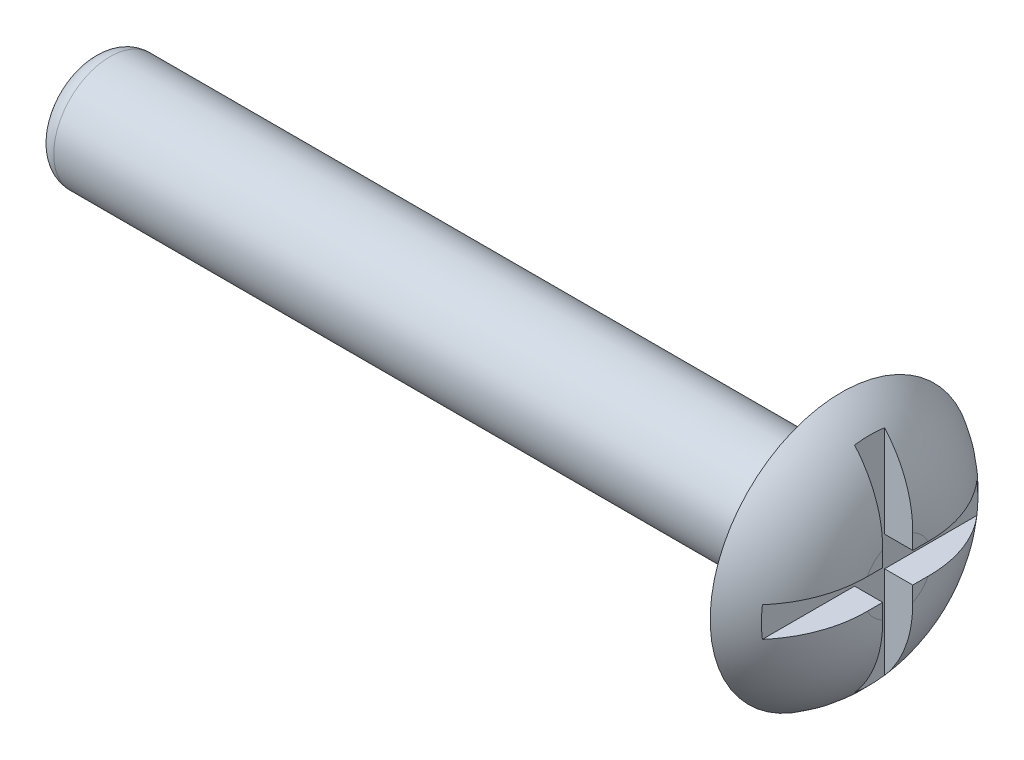
ISO-10303-21;
HEADER;
FILE_DESCRIPTION(('STEP AP214'),'2;1');
FILE_NAME('part.step','',(''),(''),'','','');
FILE_SCHEMA(('AUTOMOTIVE_DESIGN { 1 0 10303 214 1 1 1 1 }'));
ENDSEC;
DATA;
#1=APPLICATION_CONTEXT('core data for automotive mechanical design processes');
#2=APPLICATION_PROTOCOL_DEFINITION('international standard','automotive_design',2000,#1);
#3=PRODUCT_CONTEXT('',#1,'mechanical');
#4=PRODUCT('Part','Part','',(#3));
#5=PRODUCT_RELATED_PRODUCT_CATEGORY('part','',(#4));
#6=PRODUCT_DEFINITION_FORMATION('','',#4);
#7=PRODUCT_DEFINITION_CONTEXT('part definition',#1,'design');
#8=PRODUCT_DEFINITION('design','',#6,#7);
#9=PRODUCT_DEFINITION_SHAPE('','',#8);
#10=(LENGTH_UNIT() NAMED_UNIT(*) SI_UNIT(.MILLI.,.METRE.));
#11=(NAMED_UNIT(*) PLANE_ANGLE_UNIT() SI_UNIT($,.RADIAN.));
#12=(NAMED_UNIT(*) SI_UNIT($,.STERADIAN.) SOLID_ANGLE_UNIT());
#13=UNCERTAINTY_MEASURE_WITH_UNIT(LENGTH_MEASURE(1.E-05),#10,'distance_accuracy_value','');
#14=(GEOMETRIC_REPRESENTATION_CONTEXT(3) GLOBAL_UNCERTAINTY_ASSIGNED_CONTEXT((#13)) GLOBAL_UNIT_ASSIGNED_CONTEXT((#10,
#11,#12)) REPRESENTATION_CONTEXT('',''));
#15=CARTESIAN_POINT('',(0.,0.,0.));
#16=DIRECTION('',(0.,0.,1.));
#17=DIRECTION('',(1.,0.,0.));
#18=AXIS2_PLACEMENT_3D('',#15,#16,#17);
#19=CARTESIAN_POINT('',(-22.7015195369031,-52.7054269175109,-64.1999999999995));
#20=DIRECTION('',(1.,0.,0.));
#21=DIRECTION('',(0.,0.,-1.));
#22=AXIS2_PLACEMENT_3D('',#19,#20,#21);
#23=PLANE('',#22);
#24=DIRECTION('',(0.,-1.,0.));
#25=VECTOR('',#24,1.);
#26=CARTESIAN_POINT('',(-22.7015195369031,-59.5054269175109,-64.1999999999995));
#27=LINE('',#26,#25);
#28=CARTESIAN_POINT('',(-22.7015195369031,-59.5054269175109,-64.1999999999995));
#29=VERTEX_POINT('',#28);
#30=CARTESIAN_POINT('',(-22.7015195369031,-64.422197191001,-64.1999999999995));
#31=VERTEX_POINT('',#30);
#32=EDGE_CURVE('E395',#29,#31,#27,.T.);
#33=ORIENTED_EDGE('',*,*,#32,.T.);
#34=CARTESIAN_POINT('',(-22.7015195369031,-58.7054269175109,-64.9999999999995));
#35=DIRECTION('',(1.,0.,0.));
#36=DIRECTION('',(0.,0.,-1.));
#37=AXIS2_PLACEMENT_3D('',#34,#35,#36);
#38=CIRCLE('',#37,5.77247454389025);
#39=CARTESIAN_POINT('',(-22.7015195369031,-64.422197191001,-65.7999999999995));
#40=VERTEX_POINT('',#39);
#41=EDGE_CURVE('E316',#31,#40,#38,.T.);
#42=ORIENTED_EDGE('',*,*,#41,.T.);
#43=DIRECTION('',(0.,1.,0.));
#44=VECTOR('',#43,1.);
#45=CARTESIAN_POINT('',(-22.7015195369031,-64.7054269175109,-65.7999999999995));
#46=LINE('',#45,#44);
#47=CARTESIAN_POINT('',(-22.7015195369031,-59.5054269175109,-65.7999999999995));
#48=VERTEX_POINT('',#47);
#49=EDGE_CURVE('E406',#40,#48,#46,.T.);
#50=ORIENTED_EDGE('',*,*,#49,.T.);
#51=DIRECTION('',(0.,0.,-1.));
#52=VECTOR('',#51,1.);
#53=CARTESIAN_POINT('',(-22.7015195369031,-59.5054269175109,-65.7999999999995));
#54=LINE('',#53,#52);
#55=CARTESIAN_POINT('',(-22.7015195369031,-59.5054269175109,-70.7167702734896));
#56=VERTEX_POINT('',#55);
#57=EDGE_CURVE('E117',#48,#56,#54,.T.);
#58=ORIENTED_EDGE('',*,*,#57,.T.);
#59=CARTESIAN_POINT('',(-22.7015195369031,-58.7054269175109,-64.9999999999995));
#60=DIRECTION('',(1.,0.,0.));
#61=DIRECTION('',(0.,0.,-1.));
#62=AXIS2_PLACEMENT_3D('',#59,#60,#61);
#63=CIRCLE('',#62,5.77247454389025);
#64=CARTESIAN_POINT('',(-22.7015195369031,-57.9054269175109,-70.7167702734896));
#65=VERTEX_POINT('',#64);
#66=EDGE_CURVE('E110',#56,#65,#63,.T.);
#67=ORIENTED_EDGE('',*,*,#66,.T.);
#68=DIRECTION('',(0.,0.,1.));
#69=VECTOR('',#68,1.);
#70=CARTESIAN_POINT('',(-22.7015195369031,-57.9054269175109,-70.9999999999995));
#71=LINE('',#70,#69);
#72=CARTESIAN_POINT('',(-22.7015195369031,-57.9054269175109,-65.7999999999995));
#73=VERTEX_POINT('',#72);
#74=EDGE_CURVE('E114',#65,#73,#71,.T.);
#75=ORIENTED_EDGE('',*,*,#74,.T.);
#76=DIRECTION('',(0.,1.,0.));
#77=VECTOR('',#76,1.);
#78=CARTESIAN_POINT('',(-22.7015195369031,-57.9054269175109,-65.7999999999995));
#79=LINE('',#78,#77);
#80=CARTESIAN_POINT('',(-22.7015195369031,-52.9886566440207,-65.7999999999995));
#81=VERTEX_POINT('',#80);
#82=EDGE_CURVE('E491',#73,#81,#79,.T.);
#83=ORIENTED_EDGE('',*,*,#82,.T.);
#84=CARTESIAN_POINT('',(-22.7015195369031,-58.7054269175109,-64.9999999999995));
#85=DIRECTION('',(1.,0.,0.));
#86=DIRECTION('',(0.,0.,-1.));
#87=AXIS2_PLACEMENT_3D('',#84,#85,#86);
#88=CIRCLE('',#87,5.77247454389025);
#89=CARTESIAN_POINT('',(-22.7015195369031,-52.9886566440207,-64.1999999999995));
#90=VERTEX_POINT('',#89);
#91=EDGE_CURVE('E122',#81,#90,#88,.T.);
#92=ORIENTED_EDGE('',*,*,#91,.T.);
#93=DIRECTION('',(0.,1.,0.));
#94=VECTOR('',#93,1.);
#95=CARTESIAN_POINT('',(-22.7015195369031,-52.7054269175109,-64.1999999999995));
#96=LINE('',#95,#94);
#97=CARTESIAN_POINT('',(-22.7015195369031,-57.9054269175109,-64.1999999999995));
#98=VERTEX_POINT('',#97);
#99=EDGE_CURVE('E433',#90,#98,#96,.F.);
#100=ORIENTED_EDGE('',*,*,#99,.T.);
#101=DIRECTION('',(0.,0.,1.));
#102=VECTOR('',#101,1.);
#103=CARTESIAN_POINT('',(-22.7015195369031,-57.9054269175109,-64.1999999999995));
#104=LINE('',#103,#102);
#105=CARTESIAN_POINT('',(-22.7015195369031,-57.9054269175109,-59.2832297265093));
#106=VERTEX_POINT('',#105);
#107=EDGE_CURVE('E450',#98,#106,#104,.T.);
#108=ORIENTED_EDGE('',*,*,#107,.T.);
#109=CARTESIAN_POINT('',(-22.7015195369031,-58.7054269175109,-64.9999999999995));
#110=DIRECTION('',(1.,0.,0.));
#111=DIRECTION('',(0.,0.,-1.));
#112=AXIS2_PLACEMENT_3D('',#109,#110,#111);
#113=CIRCLE('',#112,5.77247454389025);
#114=CARTESIAN_POINT('',(-22.7015195369031,-59.5054269175109,-59.2832297265093));
#115=VERTEX_POINT('',#114);
#116=EDGE_CURVE('E446',#106,#115,#113,.T.);
#117=ORIENTED_EDGE('',*,*,#116,.T.);
#118=DIRECTION('',(0.,0.,-1.));
#119=VECTOR('',#118,1.);
#120=CARTESIAN_POINT('',(-22.7015195369031,-59.5054269175109,-58.9999999999995));
#121=LINE('',#120,#119);
#122=EDGE_CURVE('E394',#115,#29,#121,.T.);
#123=ORIENTED_EDGE('',*,*,#122,.T.);
#124=EDGE_LOOP('',(#33,#42,#50,#58,#67,#75,#83,#92,#100,#108,#117,#123));
#125=FACE_BOUND('',#124,.T.);
#126=ADVANCED_FACE('F16',(#125),#23,.T.);
#127=CARTESIAN_POINT('',(-21.2015195369031,-59.5054269175109,-65.7999999999995));
#128=DIRECTION('',(0.,-1.,0.));
#129=DIRECTION('',(0.,0.,-1.));
#130=AXIS2_PLACEMENT_3D('',#127,#128,#129);
#131=PLANE('',#130);
#132=ORIENTED_EDGE('',*,*,#57,.F.);
#133=DIRECTION('',(1.,0.,0.));
#134=VECTOR('',#133,1.);
#135=CARTESIAN_POINT('',(-21.2015195369031,-59.5054269175109,-65.7999999999995));
#136=LINE('',#135,#134);
#137=CARTESIAN_POINT('',(-21.2015195369031,-59.5054269175109,-65.7999999999995));
#138=VERTEX_POINT('',#137);
#139=EDGE_CURVE('E403',#48,#138,#136,.T.);
#140=ORIENTED_EDGE('',*,*,#139,.T.);
#141=DIRECTION('',(0.,0.,1.));
#142=VECTOR('',#141,1.);
#143=CARTESIAN_POINT('',(-21.2015195369031,-59.5054269175109,-64.9999999999995));
#144=LINE('',#143,#142);
#145=CARTESIAN_POINT('',(-21.2015195369031,-59.5054269175109,-66.6167455217521));
#146=VERTEX_POINT('',#145);
#147=EDGE_CURVE('E408',#138,#146,#144,.F.);
#148=ORIENTED_EDGE('',*,*,#147,.T.);
#149=CARTESIAN_POINT('',(-22.7015195369031,-59.5054269175109,-70.7167702734896));
#150=CARTESIAN_POINT('',(-22.5902924719036,-59.5054269175109,-70.5894519305849));
#151=CARTESIAN_POINT('',(-22.4844841044207,-59.5054269175109,-70.4574079350868));
#152=CARTESIAN_POINT('',(-22.2843771707988,-59.5054269175109,-70.1848873187023));
#153=CARTESIAN_POINT('',(-22.1900775154616,-59.5054269175109,-70.044411497694));
#154=CARTESIAN_POINT('',(-22.013790674151,-59.5054269175109,-69.7562691738954));
#155=CARTESIAN_POINT('',(-21.9317826107187,-59.5054269175109,-69.6086154412117));
#156=CARTESIAN_POINT('',(-21.7804175594813,-59.5054269175109,-69.3069662961564));
#157=CARTESIAN_POINT('',(-21.7110602650705,-59.5054269175109,-69.1529710375899));
#158=CARTESIAN_POINT('',(-21.5852093045599,-59.5054269175109,-68.8392318582316));
#159=CARTESIAN_POINT('',(-21.5287581905337,-59.5054269175109,-68.6794708763358));
#160=CARTESIAN_POINT('',(-21.4292901302814,-59.5054269175109,-68.3558188673695));
#161=CARTESIAN_POINT('',(-21.3862735193933,-59.5054269175109,-68.1919277373169));
#162=CARTESIAN_POINT('',(-21.3138216009873,-59.5054269175109,-67.8613904089827));
#163=CARTESIAN_POINT('',(-21.28436992788,-59.5054269175109,-67.6947477831626));
#164=CARTESIAN_POINT('',(-21.238833448118,-59.5054269175109,-67.3597114235856));
#165=CARTESIAN_POINT('',(-21.2227430284098,-59.5054269175109,-67.1913184552802));
#166=CARTESIAN_POINT('',(-21.2091154622316,-59.5054269175109,-66.9549895575078));
#167=CARTESIAN_POINT('',(-21.2062383174044,-59.5054269175109,-66.8873208530145));
#168=CARTESIAN_POINT('',(-21.202439484687,-59.5054269175109,-66.7520179422398));
#169=CARTESIAN_POINT('',(-21.2015152087335,-59.5054269175109,-66.6843838092079));
#170=CARTESIAN_POINT('',(-21.2015195369031,-59.5054269175109,-66.6167455217521));
#171=B_SPLINE_CURVE_WITH_KNOTS('',3,(#149,#150,#151,#152,#153,#154,#155,#156,#157,#158,#159,
#160,#161,#162,#163,#164,#165,#166,#167,#168,#169,#170),.UNSPECIFIED.,.F.,.F.,(4,2,2,2,2,2,2,2,
2,2,4),(0.,0.507021458868819,1.01399489535608,1.52009722612395,2.02618728929631,
2.53392262771866,3.04167063868922,3.54880445567521,4.05572511815057,4.25889309987192,
4.46179166142017),.UNSPECIFIED.);
#172=EDGE_CURVE('E208',#56,#146,#171,.T.);
#173=ORIENTED_EDGE('',*,*,#172,.F.);
#174=EDGE_LOOP('',(#132,#140,#148,#173));
#175=FACE_BOUND('',#174,.T.);
#176=ADVANCED_FACE('F318',(#175),#131,.F.);
#177=CARTESIAN_POINT('',(-21.2015195369031,-58.7054269175109,-64.9999999999995));
#178=DIRECTION('',(-1.,0.,0.));
#179=DIRECTION('',(0.,0.,1.));
#180=AXIS2_PLACEMENT_3D('',#177,#178,#179);
#181=PLANE('',#180);
#182=DIRECTION('',(0.,1.,0.));
#183=VECTOR('',#182,1.);
#184=CARTESIAN_POINT('',(-21.2015195369031,-64.7054269175109,-65.7999999999995));
#185=LINE('',#184,#183);
#186=CARTESIAN_POINT('',(-21.2015195369031,-60.3221724392635,-65.7999999999995));
#187=VERTEX_POINT('',#186);
#188=EDGE_CURVE('E399',#138,#187,#185,.F.);
#189=ORIENTED_EDGE('',*,*,#188,.T.);
#190=CARTESIAN_POINT('',(-21.2015195369031,-58.7054269175109,-64.9999999999995));
#191=DIRECTION('',(-1.,0.,0.));
#192=DIRECTION('',(0.,-0.443496451734795,-0.896276127819238));
#193=AXIS2_PLACEMENT_3D('',#190,#191,#192);
#194=CIRCLE('',#193,1.80384757729334);
#195=EDGE_CURVE('E310',#146,#187,#194,.T.);
#196=ORIENTED_EDGE('',*,*,#195,.F.);
#197=ORIENTED_EDGE('',*,*,#147,.F.);
#198=EDGE_LOOP('',(#189,#196,#197));
#199=FACE_BOUND('',#198,.T.);
#200=ADVANCED_FACE('F301',(#199),#181,.F.);
#201=CARTESIAN_POINT('',(-21.2015195369031,-64.7054269175109,-65.7999999999995));
#202=DIRECTION('',(0.,0.,-1.));
#203=DIRECTION('',(0.,1.,0.));
#204=AXIS2_PLACEMENT_3D('',#201,#202,#203);
#205=PLANE('',#204);
#206=ORIENTED_EDGE('',*,*,#188,.F.);
#207=ORIENTED_EDGE('',*,*,#139,.F.);
#208=ORIENTED_EDGE('',*,*,#49,.F.);
#209=CARTESIAN_POINT('',(-21.2015195369031,-60.3221724392635,-65.7999999999995));
#210=CARTESIAN_POINT('',(-21.2014935684585,-60.4225474884826,-65.7999999999995));
#211=CARTESIAN_POINT('',(-21.2035451273992,-60.522933473525,-65.7999999999995));
#212=CARTESIAN_POINT('',(-21.2120240881543,-60.7235157177352,-65.7999999999995));
#213=CARTESIAN_POINT('',(-21.2184513558384,-60.823711982624,-65.7999999999995));
#214=CARTESIAN_POINT('',(-21.235928141249,-61.0240033018482,-65.7999999999995));
#215=CARTESIAN_POINT('',(-21.2469911899811,-61.1240971929979,-65.7999999999995));
#216=CARTESIAN_POINT('',(-21.27383800573,-61.3236600449382,-65.7999999999995));
#217=CARTESIAN_POINT('',(-21.2896225063479,-61.42312890616,-65.7999999999995));
#218=CARTESIAN_POINT('',(-21.339017633634,-61.6922887657982,-65.7999999999995));
#219=CARTESIAN_POINT('',(-21.3772921047834,-61.8611503231658,-65.7999999999995));
#220=CARTESIAN_POINT('',(-21.4679523714872,-62.1950945736488,-65.7999999999995));
#221=CARTESIAN_POINT('',(-21.5203433314351,-62.3601758597565,-65.7999999999995));
#222=CARTESIAN_POINT('',(-21.6389543987497,-62.6851604329085,-65.7999999999995));
#223=CARTESIAN_POINT('',(-21.7051639010775,-62.8450675827703,-65.7999999999995));
#224=CARTESIAN_POINT('',(-21.8510024693983,-63.1585607251511,-65.7999999999995));
#225=CARTESIAN_POINT('',(-21.9306264312774,-63.3121490943729,-65.7999999999995));
#226=CARTESIAN_POINT('',(-22.1148117710492,-63.6328358453291,-65.7999999999995));
#227=CARTESIAN_POINT('',(-22.2213023593311,-63.7988306190098,-65.7999999999995));
#228=CARTESIAN_POINT('',(-22.4499285111504,-64.1194171565602,-65.7999999999995));
#229=CARTESIAN_POINT('',(-22.5720482336807,-64.2740202199493,-65.7999999999995));
#230=CARTESIAN_POINT('',(-22.7015195369031,-64.422197191001,-65.7999999999995));
#231=B_SPLINE_CURVE_WITH_KNOTS('',3,(#209,#210,#211,#212,#213,#214,#215,#216,#217,#218,#219,
#220,#221,#222,#223,#224,#225,#226,#227,#228,#229,#230),.UNSPECIFIED.,.F.,.F.,(4,2,2,2,2,2,2,2,
2,2,4),(0.,0.301118877302648,0.602228524711781,0.904223246980938,1.20626491642571,
1.72504910814735,2.24402335081095,2.7626007617304,3.28098130114165,3.87166508988008,
4.46175485968447),.UNSPECIFIED.);
#232=EDGE_CURVE('E285',#187,#40,#231,.T.);
#233=ORIENTED_EDGE('',*,*,#232,.F.);
#234=EDGE_LOOP('',(#206,#207,#208,#233));
#235=FACE_BOUND('',#234,.T.);
#236=ADVANCED_FACE('F296',(#235),#205,.F.);
#237=CARTESIAN_POINT('',(-21.2015195369031,-59.5054269175109,-64.1999999999995));
#238=DIRECTION('',(0.,0.,1.));
#239=DIRECTION('',(0.,-1.,0.));
#240=AXIS2_PLACEMENT_3D('',#237,#238,#239);
#241=PLANE('',#240);
#242=ORIENTED_EDGE('',*,*,#32,.F.);
#243=DIRECTION('',(1.,0.,0.));
#244=VECTOR('',#243,1.);
#245=CARTESIAN_POINT('',(-21.2015195369031,-59.5054269175109,-64.1999999999995));
#246=LINE('',#245,#244);
#247=CARTESIAN_POINT('',(-21.2015195369031,-59.5054269175109,-64.1999999999995));
#248=VERTEX_POINT('',#247);
#249=EDGE_CURVE('E436',#29,#248,#246,.T.);
#250=ORIENTED_EDGE('',*,*,#249,.T.);
#251=DIRECTION('',(0.,1.,0.));
#252=VECTOR('',#251,1.);
#253=CARTESIAN_POINT('',(-21.2015195369031,-58.7054269175109,-64.1999999999995));
#254=LINE('',#253,#252);
#255=CARTESIAN_POINT('',(-21.2015195369031,-60.3221724392635,-64.1999999999995));
#256=VERTEX_POINT('',#255);
#257=EDGE_CURVE('E378',#248,#256,#254,.F.);
#258=ORIENTED_EDGE('',*,*,#257,.T.);
#259=CARTESIAN_POINT('',(-22.7015195369031,-64.422197191001,-64.1999999999995));
#260=CARTESIAN_POINT('',(-22.5902924719036,-64.2948788480963,-64.1999999999995));
#261=CARTESIAN_POINT('',(-22.4844841044207,-64.1628348525982,-64.1999999999995));
#262=CARTESIAN_POINT('',(-22.2843771707988,-63.8903142362137,-64.1999999999995));
#263=CARTESIAN_POINT('',(-22.1900775154616,-63.7498384152054,-64.1999999999995));
#264=CARTESIAN_POINT('',(-22.0137906741511,-63.4616960914068,-64.1999999999995));
#265=CARTESIAN_POINT('',(-21.9317826107187,-63.3140423587231,-64.1999999999995));
#266=CARTESIAN_POINT('',(-21.7804175594812,-63.0123932136678,-64.1999999999995));
#267=CARTESIAN_POINT('',(-21.7110602650704,-62.8583979551014,-64.1999999999995));
#268=CARTESIAN_POINT('',(-21.5852093045599,-62.544658775743,-64.1999999999995));
#269=CARTESIAN_POINT('',(-21.5287581905337,-62.3848977938472,-64.1999999999995));
#270=CARTESIAN_POINT('',(-21.4292901302814,-62.0612457848809,-64.1999999999995));
#271=CARTESIAN_POINT('',(-21.3862735193933,-61.8973546548283,-64.1999999999995));
#272=CARTESIAN_POINT('',(-21.3138216009873,-61.5668173264941,-64.1999999999995));
#273=CARTESIAN_POINT('',(-21.28436992788,-61.400174700674,-64.1999999999995));
#274=CARTESIAN_POINT('',(-21.238833448118,-61.065138341097,-64.1999999999995));
#275=CARTESIAN_POINT('',(-21.2227430284098,-60.8967453727916,-64.1999999999995));
#276=CARTESIAN_POINT('',(-21.2091154622316,-60.6604164750193,-64.1999999999995));
#277=CARTESIAN_POINT('',(-21.2062383174044,-60.5927477705259,-64.1999999999995));
#278=CARTESIAN_POINT('',(-21.202439484687,-60.4574448597512,-64.1999999999995));
#279=CARTESIAN_POINT('',(-21.2015152087335,-60.3898107267193,-64.1999999999995));
#280=CARTESIAN_POINT('',(-21.2015195369031,-60.3221724392635,-64.1999999999995));
#281=B_SPLINE_CURVE_WITH_KNOTS('',3,(#259,#260,#261,#262,#263,#264,#265,#266,#267,#268,#269,
#270,#271,#272,#273,#274,#275,#276,#277,#278,#279,#280),.UNSPECIFIED.,.F.,.F.,(4,2,2,2,2,2,2,2,
2,2,4),(0.,0.507021458868806,1.01399489535608,1.52009722612395,2.0261872892963,2.53392262771864,
3.0416706386892,3.54880445567516,4.05572511815053,4.25889309987188,4.46179166142015),.UNSPECIFIED.);
#282=EDGE_CURVE('E281',#31,#256,#281,.T.);
#283=ORIENTED_EDGE('',*,*,#282,.F.);
#284=EDGE_LOOP('',(#242,#250,#258,#283));
#285=FACE_BOUND('',#284,.T.);
#286=ADVANCED_FACE('F292',(#285),#241,.F.);
#287=CARTESIAN_POINT('',(-21.2015195369031,-58.7054269175109,-64.9999999999995));
#288=DIRECTION('',(-1.,0.,0.));
#289=DIRECTION('',(0.,0.,1.));
#290=AXIS2_PLACEMENT_3D('',#287,#288,#289);
#291=PLANE('',#290);
#292=DIRECTION('',(0.,0.,-1.));
#293=VECTOR('',#292,1.);
#294=CARTESIAN_POINT('',(-21.2015195369031,-59.5054269175109,-58.9999999999995));
#295=LINE('',#294,#293);
#296=CARTESIAN_POINT('',(-21.2015195369031,-59.5054269175109,-63.3832544782468));
#297=VERTEX_POINT('',#296);
#298=EDGE_CURVE('E380',#248,#297,#295,.F.);
#299=ORIENTED_EDGE('',*,*,#298,.T.);
#300=CARTESIAN_POINT('',(-21.2015195369031,-58.7054269175109,-64.9999999999995));
#301=DIRECTION('',(-1.,0.,0.));
#302=DIRECTION('',(0.,-0.896276127819241,0.443496451734789));
#303=AXIS2_PLACEMENT_3D('',#300,#301,#302);
#304=CIRCLE('',#303,1.80384757729335);
#305=EDGE_CURVE('E284',#256,#297,#304,.T.);
#306=ORIENTED_EDGE('',*,*,#305,.F.);
#307=ORIENTED_EDGE('',*,*,#257,.F.);
#308=EDGE_LOOP('',(#299,#306,#307));
#309=FACE_BOUND('',#308,.T.);
#310=ADVANCED_FACE('F272',(#309),#291,.F.);
#311=CARTESIAN_POINT('',(-21.2015195369031,-59.5054269175109,-58.9999999999995));
#312=DIRECTION('',(0.,-1.,0.));
#313=DIRECTION('',(0.,0.,-1.));
#314=AXIS2_PLACEMENT_3D('',#311,#312,#313);
#315=PLANE('',#314);
#316=ORIENTED_EDGE('',*,*,#298,.F.);
#317=ORIENTED_EDGE('',*,*,#249,.F.);
#318=ORIENTED_EDGE('',*,*,#122,.F.);
#319=CARTESIAN_POINT('',(-21.2015195369031,-59.5054269175109,-63.3832544782468));
#320=CARTESIAN_POINT('',(-21.2014935684585,-59.5054269175109,-63.2828794290277));
#321=CARTESIAN_POINT('',(-21.2035451273992,-59.5054269175109,-63.1824934439853));
#322=CARTESIAN_POINT('',(-21.2120240881543,-59.5054269175109,-62.9819111997751));
#323=CARTESIAN_POINT('',(-21.2184513558384,-59.5054269175109,-62.8817149348863));
#324=CARTESIAN_POINT('',(-21.235928141249,-59.5054269175109,-62.6814236156621));
#325=CARTESIAN_POINT('',(-21.2469911899811,-59.5054269175109,-62.5813297245124));
#326=CARTESIAN_POINT('',(-21.27383800573,-59.5054269175109,-62.3817668725721));
#327=CARTESIAN_POINT('',(-21.2896225063479,-59.5054269175109,-62.2822980113503));
#328=CARTESIAN_POINT('',(-21.339017633634,-59.5054269175109,-62.0131381517121));
#329=CARTESIAN_POINT('',(-21.3772921047834,-59.5054269175109,-61.8442765943445));
#330=CARTESIAN_POINT('',(-21.4679523714873,-59.5054269175109,-61.5103323438615));
#331=CARTESIAN_POINT('',(-21.5203433314352,-59.5054269175109,-61.3452510577538));
#332=CARTESIAN_POINT('',(-21.6389543987497,-59.5054269175109,-61.0202664846018));
#333=CARTESIAN_POINT('',(-21.7051639010775,-59.5054269175109,-60.86035933474));
#334=CARTESIAN_POINT('',(-21.8510024693984,-59.5054269175109,-60.5468661923592));
#335=CARTESIAN_POINT('',(-21.9306264312774,-59.5054269175109,-60.3932778231375));
#336=CARTESIAN_POINT('',(-22.1148117710493,-59.5054269175109,-60.0725910721812));
#337=CARTESIAN_POINT('',(-22.2213023593311,-59.5054269175109,-59.9065962985005));
#338=CARTESIAN_POINT('',(-22.4499285111505,-59.5054269175109,-59.5860097609502));
#339=CARTESIAN_POINT('',(-22.5720482336808,-59.5054269175109,-59.431406697561));
#340=CARTESIAN_POINT('',(-22.7015195369031,-59.5054269175109,-59.2832297265093));
#341=B_SPLINE_CURVE_WITH_KNOTS('',3,(#319,#320,#321,#322,#323,#324,#325,#326,#327,#328,#329,
#330,#331,#332,#333,#334,#335,#336,#337,#338,#339,#340),.UNSPECIFIED.,.F.,.F.,(4,2,2,2,2,2,2,2,
2,2,4),(0.,0.301118877302655,0.602228524711788,0.904223246980952,1.20626491642572,
1.72504910814734,2.24402335081095,2.7626007617304,3.28098130114165,3.87166508988007,
4.46175485968446),.UNSPECIFIED.);
#342=EDGE_CURVE('E253',#297,#115,#341,.T.);
#343=ORIENTED_EDGE('',*,*,#342,.F.);
#344=EDGE_LOOP('',(#316,#317,#318,#343));
#345=FACE_BOUND('',#344,.T.);
#346=ADVANCED_FACE('F266',(#345),#315,.F.);
#347=CARTESIAN_POINT('',(-21.2015195369031,-57.9054269175109,-64.1999999999995));
#348=DIRECTION('',(0.,1.,0.));
#349=DIRECTION('',(0.,0.,1.));
#350=AXIS2_PLACEMENT_3D('',#347,#348,#349);
#351=PLANE('',#350);
#352=ORIENTED_EDGE('',*,*,#107,.F.);
#353=DIRECTION('',(1.,0.,0.));
#354=VECTOR('',#353,1.);
#355=CARTESIAN_POINT('',(-21.2015195369031,-57.9054269175109,-64.1999999999995));
#356=LINE('',#355,#354);
#357=CARTESIAN_POINT('',(-21.2015195369031,-57.9054269175109,-64.1999999999995));
#358=VERTEX_POINT('',#357);
#359=EDGE_CURVE('E430',#98,#358,#356,.T.);
#360=ORIENTED_EDGE('',*,*,#359,.T.);
#361=DIRECTION('',(0.,0.,1.));
#362=VECTOR('',#361,1.);
#363=CARTESIAN_POINT('',(-21.2015195369031,-57.9054269175109,-64.9999999999995));
#364=LINE('',#363,#362);
#365=CARTESIAN_POINT('',(-21.2015195369031,-57.9054269175109,-63.3832544782468));
#366=VERTEX_POINT('',#365);
#367=EDGE_CURVE('E453',#358,#366,#364,.T.);
#368=ORIENTED_EDGE('',*,*,#367,.T.);
#369=CARTESIAN_POINT('',(-22.7015195369031,-57.9054269175109,-59.2832297265093));
#370=CARTESIAN_POINT('',(-22.5902924719037,-57.9054269175109,-59.410548069414));
#371=CARTESIAN_POINT('',(-22.4844841044208,-57.9054269175109,-59.5425920649121));
#372=CARTESIAN_POINT('',(-22.2843771707988,-57.9054269175109,-59.8151126812966));
#373=CARTESIAN_POINT('',(-22.1900775154617,-57.9054269175109,-59.955588502305));
#374=CARTESIAN_POINT('',(-22.0137906741511,-57.9054269175109,-60.2437308261035));
#375=CARTESIAN_POINT('',(-21.9317826107187,-57.9054269175109,-60.3913845587872));
#376=CARTESIAN_POINT('',(-21.7804175594813,-57.9054269175109,-60.6930337038425));
#377=CARTESIAN_POINT('',(-21.7110602650705,-57.9054269175109,-60.847028962409));
#378=CARTESIAN_POINT('',(-21.5852093045599,-57.9054269175109,-61.1607681417673));
#379=CARTESIAN_POINT('',(-21.5287581905337,-57.9054269175109,-61.3205291236631));
#380=CARTESIAN_POINT('',(-21.4292901302814,-57.9054269175109,-61.6441811326294));
#381=CARTESIAN_POINT('',(-21.3862735193934,-57.9054269175109,-61.808072262682));
#382=CARTESIAN_POINT('',(-21.3138216009873,-57.9054269175109,-62.1386095910162));
#383=CARTESIAN_POINT('',(-21.28436992788,-57.9054269175109,-62.3052522168364));
#384=CARTESIAN_POINT('',(-21.238833448118,-57.9054269175109,-62.6402885764133));
#385=CARTESIAN_POINT('',(-21.2227430284098,-57.9054269175109,-62.8086815447187));
#386=CARTESIAN_POINT('',(-21.2091154622316,-57.9054269175109,-63.0450104424911));
#387=CARTESIAN_POINT('',(-21.2062383174044,-57.9054269175109,-63.1126791469844));
#388=CARTESIAN_POINT('',(-21.202439484687,-57.9054269175109,-63.2479820577591));
#389=CARTESIAN_POINT('',(-21.2015152087335,-57.9054269175109,-63.315616190791));
#390=CARTESIAN_POINT('',(-21.2015195369031,-57.9054269175109,-63.3832544782468));
#391=B_SPLINE_CURVE_WITH_KNOTS('',3,(#369,#370,#371,#372,#373,#374,#375,#376,#377,#378,#379,
#380,#381,#382,#383,#384,#385,#386,#387,#388,#389,#390),.UNSPECIFIED.,.F.,.F.,(4,2,2,2,2,2,2,2,
2,2,4),(0.,0.507021458868806,1.01399489535605,1.52009722612392,2.02618728929628,
2.53392262771863,3.0416706386892,3.54880445567517,4.05572511815054,4.25889309987189,
4.46179166142012),.UNSPECIFIED.);
#392=EDGE_CURVE('E251',#106,#366,#391,.T.);
#393=ORIENTED_EDGE('',*,*,#392,.F.);
#394=EDGE_LOOP('',(#352,#360,#368,#393));
#395=FACE_BOUND('',#394,.T.);
#396=ADVANCED_FACE('F261',(#395),#351,.F.);
#397=CARTESIAN_POINT('',(-21.2015195369031,-58.7054269175109,-64.9999999999995));
#398=DIRECTION('',(-1.,0.,0.));
#399=DIRECTION('',(0.,0.,1.));
#400=AXIS2_PLACEMENT_3D('',#397,#398,#399);
#401=PLANE('',#400);
#402=DIRECTION('',(0.,1.,0.));
#403=VECTOR('',#402,1.);
#404=CARTESIAN_POINT('',(-21.2015195369031,-52.7054269175109,-64.1999999999995));
#405=LINE('',#404,#403);
#406=CARTESIAN_POINT('',(-21.2015195369031,-57.0886813957583,-64.1999999999995));
#407=VERTEX_POINT('',#406);
#408=EDGE_CURVE('E432',#358,#407,#405,.T.);
#409=ORIENTED_EDGE('',*,*,#408,.T.);
#410=CARTESIAN_POINT('',(-21.2015195369031,-58.7054269175109,-64.9999999999995));
#411=DIRECTION('',(-1.,0.,0.));
#412=DIRECTION('',(0.,0.443496451734767,0.896276127819252));
#413=AXIS2_PLACEMENT_3D('',#410,#411,#412);
#414=CIRCLE('',#413,1.80384757729344);
#415=EDGE_CURVE('E245',#366,#407,#414,.T.);
#416=ORIENTED_EDGE('',*,*,#415,.F.);
#417=ORIENTED_EDGE('',*,*,#367,.F.);
#418=EDGE_LOOP('',(#409,#416,#417));
#419=FACE_BOUND('',#418,.T.);
#420=ADVANCED_FACE('F265',(#419),#401,.F.);
#421=CARTESIAN_POINT('',(-21.2015195369031,-52.7054269175109,-64.1999999999995));
#422=DIRECTION('',(0.,0.,1.));
#423=DIRECTION('',(1.,0.,0.));
#424=AXIS2_PLACEMENT_3D('',#421,#422,#423);
#425=PLANE('',#424);
#426=ORIENTED_EDGE('',*,*,#408,.F.);
#427=ORIENTED_EDGE('',*,*,#359,.F.);
#428=ORIENTED_EDGE('',*,*,#99,.F.);
#429=CARTESIAN_POINT('',(-21.2015195369031,-57.0886813957583,-64.1999999999995));
#430=CARTESIAN_POINT('',(-21.2014935684585,-56.9883063465392,-64.1999999999995));
#431=CARTESIAN_POINT('',(-21.2035451273992,-56.8879203614967,-64.1999999999995));
#432=CARTESIAN_POINT('',(-21.2120240881543,-56.6873381172866,-64.1999999999995));
#433=CARTESIAN_POINT('',(-21.2184513558384,-56.5871418523977,-64.1999999999995));
#434=CARTESIAN_POINT('',(-21.235928141249,-56.3868505331736,-64.1999999999995));
#435=CARTESIAN_POINT('',(-21.2469911899811,-56.2867566420238,-64.1999999999995));
#436=CARTESIAN_POINT('',(-21.27383800573,-56.0871937900836,-64.1999999999995));
#437=CARTESIAN_POINT('',(-21.2896225063479,-55.9877249288618,-64.1999999999995));
#438=CARTESIAN_POINT('',(-21.339017633634,-55.7185650692236,-64.1999999999995));
#439=CARTESIAN_POINT('',(-21.3772921047834,-55.549703511856,-64.1999999999995));
#440=CARTESIAN_POINT('',(-21.4679523714873,-55.215759261373,-64.1999999999995));
#441=CARTESIAN_POINT('',(-21.5203433314351,-55.0506779752653,-64.1999999999995));
#442=CARTESIAN_POINT('',(-21.6389543987497,-54.7256934021133,-64.1999999999995));
#443=CARTESIAN_POINT('',(-21.7051639010775,-54.5657862522515,-64.1999999999995));
#444=CARTESIAN_POINT('',(-21.8510024693983,-54.2522931098707,-64.1999999999995));
#445=CARTESIAN_POINT('',(-21.9306264312774,-54.0987047406489,-64.1999999999995));
#446=CARTESIAN_POINT('',(-22.1148117710493,-53.7780179896927,-64.1999999999995));
#447=CARTESIAN_POINT('',(-22.2213023593311,-53.612023216012,-64.1999999999995));
#448=CARTESIAN_POINT('',(-22.4499285111505,-53.2914366784616,-64.1999999999995));
#449=CARTESIAN_POINT('',(-22.5720482336808,-53.1368336150724,-64.1999999999995));
#450=CARTESIAN_POINT('',(-22.7015195369031,-52.9886566440207,-64.1999999999995));
#451=B_SPLINE_CURVE_WITH_KNOTS('',3,(#429,#430,#431,#432,#433,#434,#435,#436,#437,#438,#439,
#440,#441,#442,#443,#444,#445,#446,#447,#448,#449,#450),.UNSPECIFIED.,.F.,.F.,(4,2,2,2,2,2,2,2,
2,2,4),(0.,0.301118877302662,0.602228524711795,0.904223246980951,1.20626491642572,
1.72504910814735,2.24402335081095,2.76260076173041,3.28098130114165,3.8716650898801,
4.46175485968454),.UNSPECIFIED.);
#452=EDGE_CURVE('E242',#407,#90,#451,.T.);
#453=ORIENTED_EDGE('',*,*,#452,.F.);
#454=EDGE_LOOP('',(#426,#427,#428,#453));
#455=FACE_BOUND('',#454,.T.);
#456=ADVANCED_FACE('F233',(#455),#425,.F.);
#457=CARTESIAN_POINT('',(-21.2015195369031,-57.9054269175109,-65.7999999999995));
#458=DIRECTION('',(0.,0.,-1.));
#459=DIRECTION('',(0.,1.,0.));
#460=AXIS2_PLACEMENT_3D('',#457,#458,#459);
#461=PLANE('',#460);
#462=ORIENTED_EDGE('',*,*,#82,.F.);
#463=DIRECTION('',(1.,0.,0.));
#464=VECTOR('',#463,1.);
#465=CARTESIAN_POINT('',(-21.2015195369031,-57.9054269175109,-65.7999999999995));
#466=LINE('',#465,#464);
#467=CARTESIAN_POINT('',(-21.2015195369031,-57.9054269175109,-65.7999999999995));
#468=VERTEX_POINT('',#467);
#469=EDGE_CURVE('E131',#73,#468,#466,.T.);
#470=ORIENTED_EDGE('',*,*,#469,.T.);
#471=DIRECTION('',(0.,1.,0.));
#472=VECTOR('',#471,1.);
#473=CARTESIAN_POINT('',(-21.2015195369031,-58.7054269175109,-65.7999999999995));
#474=LINE('',#473,#472);
#475=CARTESIAN_POINT('',(-21.2015195369031,-57.0886813957583,-65.7999999999995));
#476=VERTEX_POINT('',#475);
#477=EDGE_CURVE('E132',#468,#476,#474,.T.);
#478=ORIENTED_EDGE('',*,*,#477,.T.);
#479=CARTESIAN_POINT('',(-22.7015195369031,-52.9886566440207,-65.7999999999995));
#480=CARTESIAN_POINT('',(-22.5902924719037,-53.1159749869254,-65.7999999999995));
#481=CARTESIAN_POINT('',(-22.4844841044208,-53.2480189824235,-65.7999999999995));
#482=CARTESIAN_POINT('',(-22.2843771707988,-53.520539598808,-65.7999999999995));
#483=CARTESIAN_POINT('',(-22.1900775154617,-53.6610154198164,-65.7999999999995));
#484=CARTESIAN_POINT('',(-22.0137906741511,-53.9491577436149,-65.7999999999995));
#485=CARTESIAN_POINT('',(-21.9317826107187,-54.0968114762986,-65.7999999999995));
#486=CARTESIAN_POINT('',(-21.7804175594813,-54.3984606213539,-65.7999999999995));
#487=CARTESIAN_POINT('',(-21.7110602650705,-54.5524558799204,-65.7999999999995));
#488=CARTESIAN_POINT('',(-21.5852093045599,-54.8661950592787,-65.7999999999995));
#489=CARTESIAN_POINT('',(-21.5287581905337,-55.0259560411745,-65.7999999999995));
#490=CARTESIAN_POINT('',(-21.4292901302814,-55.3496080501408,-65.7999999999995));
#491=CARTESIAN_POINT('',(-21.3862735193934,-55.5134991801934,-65.7999999999995));
#492=CARTESIAN_POINT('',(-21.3138216009873,-55.8440365085276,-65.7999999999995));
#493=CARTESIAN_POINT('',(-21.28436992788,-56.0106791343477,-65.7999999999995));
#494=CARTESIAN_POINT('',(-21.238833448118,-56.3457154939247,-65.7999999999995));
#495=CARTESIAN_POINT('',(-21.2227430284098,-56.5141084622301,-65.7999999999995));
#496=CARTESIAN_POINT('',(-21.2091154622316,-56.7504373600025,-65.7999999999995));
#497=CARTESIAN_POINT('',(-21.2062383174044,-56.8181060644958,-65.7999999999995));
#498=CARTESIAN_POINT('',(-21.202439484687,-56.9534089752706,-65.7999999999995));
#499=CARTESIAN_POINT('',(-21.2015152087335,-57.0210431083025,-65.7999999999995));
#500=CARTESIAN_POINT('',(-21.2015195369031,-57.0886813957583,-65.7999999999995));
#501=B_SPLINE_CURVE_WITH_KNOTS('',3,(#479,#480,#481,#482,#483,#484,#485,#486,#487,#488,#489,
#490,#491,#492,#493,#494,#495,#496,#497,#498,#499,#500),.UNSPECIFIED.,.F.,.F.,(4,2,2,2,2,2,2,2,
2,2,4),(0.,0.507021458868801,1.01399489535606,1.52009722612393,2.02618728929628,
2.53392262771862,3.04167063868919,3.54880445567515,4.05572511815053,4.25889309987193,
4.46179166142023),.UNSPECIFIED.);
#502=EDGE_CURVE('E142',#81,#476,#501,.T.);
#503=ORIENTED_EDGE('',*,*,#502,.F.);
#504=EDGE_LOOP('',(#462,#470,#478,#503));
#505=FACE_BOUND('',#504,.T.);
#506=ADVANCED_FACE('F229',(#505),#461,.F.);
#507=CARTESIAN_POINT('',(-21.2015195369031,-58.7054269175109,-64.9999999999995));
#508=DIRECTION('',(-1.,0.,0.));
#509=DIRECTION('',(0.,0.,1.));
#510=AXIS2_PLACEMENT_3D('',#507,#508,#509);
#511=PLANE('',#510);
#512=DIRECTION('',(0.,0.,1.));
#513=VECTOR('',#512,1.);
#514=CARTESIAN_POINT('',(-21.2015195369031,-57.9054269175109,-70.9999999999995));
#515=LINE('',#514,#513);
#516=CARTESIAN_POINT('',(-21.2015195369031,-57.9054269175109,-66.6167455217521));
#517=VERTEX_POINT('',#516);
#518=EDGE_CURVE('E201',#468,#517,#515,.F.);
#519=ORIENTED_EDGE('',*,*,#518,.T.);
#520=CARTESIAN_POINT('',(-21.2015195369031,-58.7054269175109,-64.9999999999995));
#521=DIRECTION('',(-1.,0.,0.));
#522=DIRECTION('',(0.,0.896276127819239,-0.443496451734792));
#523=AXIS2_PLACEMENT_3D('',#520,#521,#522);
#524=CIRCLE('',#523,1.80384757729334);
#525=EDGE_CURVE('E138',#476,#517,#524,.T.);
#526=ORIENTED_EDGE('',*,*,#525,.F.);
#527=ORIENTED_EDGE('',*,*,#477,.F.);
#528=EDGE_LOOP('',(#519,#526,#527));
#529=FACE_BOUND('',#528,.T.);
#530=ADVANCED_FACE('F220',(#529),#511,.F.);
#531=CARTESIAN_POINT('',(-21.2015195369031,-57.9054269175109,-70.9999999999995));
#532=DIRECTION('',(0.,1.,0.));
#533=DIRECTION('',(0.,0.,1.));
#534=AXIS2_PLACEMENT_3D('',#531,#532,#533);
#535=PLANE('',#534);
#536=ORIENTED_EDGE('',*,*,#518,.F.);
#537=ORIENTED_EDGE('',*,*,#469,.F.);
#538=ORIENTED_EDGE('',*,*,#74,.F.);
#539=CARTESIAN_POINT('',(-21.2015195369031,-57.9054269175109,-66.6167455217521));
#540=CARTESIAN_POINT('',(-21.2014935684585,-57.9054269175109,-66.7171205709712));
#541=CARTESIAN_POINT('',(-21.2035451273992,-57.9054269175109,-66.8175065560136));
#542=CARTESIAN_POINT('',(-21.2120240881543,-57.9054269175109,-67.0180888002238));
#543=CARTESIAN_POINT('',(-21.2184513558384,-57.9054269175109,-67.1182850651126));
#544=CARTESIAN_POINT('',(-21.235928141249,-57.9054269175109,-67.3185763843368));
#545=CARTESIAN_POINT('',(-21.2469911899811,-57.9054269175109,-67.4186702754866));
#546=CARTESIAN_POINT('',(-21.27383800573,-57.9054269175109,-67.6182331274268));
#547=CARTESIAN_POINT('',(-21.2896225063479,-57.9054269175109,-67.7177019886486));
#548=CARTESIAN_POINT('',(-21.339017633634,-57.9054269175109,-67.9868618482868));
#549=CARTESIAN_POINT('',(-21.3772921047834,-57.9054269175109,-68.1557234056544));
#550=CARTESIAN_POINT('',(-21.4679523714872,-57.9054269175109,-68.4896676561374));
#551=CARTESIAN_POINT('',(-21.5203433314351,-57.9054269175109,-68.6547489422451));
#552=CARTESIAN_POINT('',(-21.6389543987497,-57.9054269175109,-68.9797335153971));
#553=CARTESIAN_POINT('',(-21.7051639010775,-57.9054269175109,-69.1396406652589));
#554=CARTESIAN_POINT('',(-21.8510024693983,-57.9054269175109,-69.4531338076397));
#555=CARTESIAN_POINT('',(-21.9306264312773,-57.9054269175109,-69.6067221768614));
#556=CARTESIAN_POINT('',(-22.1148117710492,-57.9054269175109,-69.9274089278177));
#557=CARTESIAN_POINT('',(-22.2213023593311,-57.9054269175109,-70.0934037014984));
#558=CARTESIAN_POINT('',(-22.4499285111504,-57.9054269175109,-70.4139902390488));
#559=CARTESIAN_POINT('',(-22.5720482336808,-57.9054269175109,-70.5685933024379));
#560=CARTESIAN_POINT('',(-22.7015195369031,-57.9054269175109,-70.7167702734897));
#561=B_SPLINE_CURVE_WITH_KNOTS('',3,(#539,#540,#541,#542,#543,#544,#545,#546,#547,#548,#549,
#550,#551,#552,#553,#554,#555,#556,#557,#558,#559,#560),.UNSPECIFIED.,.F.,.F.,(4,2,2,2,2,2,2,2,
2,2,4),(0.,0.301118877302655,0.602228524711802,0.904223246980958,1.20626491642573,
1.72504910814735,2.24402335081094,2.7626007617304,3.28098130114164,3.87166508988008,
4.46175485968451),.UNSPECIFIED.);
#562=EDGE_CURVE('E129',#517,#65,#561,.T.);
#563=ORIENTED_EDGE('',*,*,#562,.F.);
#564=EDGE_LOOP('',(#536,#537,#538,#563));
#565=FACE_BOUND('',#564,.T.);
#566=ADVANCED_FACE('F128',(#565),#535,.F.);
#567=CARTESIAN_POINT('',(-64.201519536903,-58.7054269175109,-64.9999999999995));
#568=DIRECTION('',(-1.,0.,0.));
#569=DIRECTION('',(0.,0.,1.));
#570=AXIS2_PLACEMENT_3D('',#567,#568,#569);
#571=PLANE('',#570);
#572=CARTESIAN_POINT('',(-64.2015195369031,-58.7054269175109,-64.9999999999995));
#573=DIRECTION('',(1.,0.,0.));
#574=DIRECTION('',(0.,0.,-1.));
#575=AXIS2_PLACEMENT_3D('',#572,#573,#574);
#576=CIRCLE('',#575,2.);
#577=CARTESIAN_POINT('',(-64.2015195369031,-58.7054269175109,-66.9999999999995));
#578=VERTEX_POINT('',#577);
#579=CARTESIAN_POINT('',(-64.2015195369031,-58.7054269175109,-62.9999999999995));
#580=VERTEX_POINT('',#579);
#581=EDGE_CURVE('E141',#578,#580,#576,.T.);
#582=ORIENTED_EDGE('',*,*,#581,.F.);
#583=CARTESIAN_POINT('',(-64.2015195369031,-58.7054269175109,-64.9999999999995));
#584=DIRECTION('',(1.,0.,0.));
#585=DIRECTION('',(0.,0.,1.));
#586=AXIS2_PLACEMENT_3D('',#583,#584,#585);
#587=CIRCLE('',#586,2.);
#588=EDGE_CURVE('E35',#580,#578,#587,.T.);
#589=ORIENTED_EDGE('',*,*,#588,.F.);
#590=EDGE_LOOP('',(#582,#589));
#591=FACE_BOUND('',#590,.T.);
#592=ADVANCED_FACE('F162',(#591),#571,.T.);
#593=CARTESIAN_POINT('',(-27.2015195369031,-58.7054269175109,-66.8038475772929));
#594=DIRECTION('',(0.,1.,0.));
#595=DIRECTION('',(0.,0.,-1.));
#596=AXIS2_PLACEMENT_3D('',#593,#594,#595);
#597=CIRCLE('',#596,6.);
#598=TRIMMED_CURVE('',#597,(PARAMETER_VALUE(-1.87616127808787)),
(PARAMETER_VALUE(1.87616127808787)),.T.,.PARAMETER.);
#599=CARTESIAN_POINT('',(-27.2015195369031,-58.7054269175109,-64.9999999999995));
#600=DIRECTION('',(1.,0.,0.));
#601=AXIS1_PLACEMENT('',#599,#600);
#602=SURFACE_OF_REVOLUTION('',#598,#601);
#603=ORIENTED_EDGE('',*,*,#116,.F.);
#604=ORIENTED_EDGE('',*,*,#392,.T.);
#605=ORIENTED_EDGE('',*,*,#415,.T.);
#606=ORIENTED_EDGE('',*,*,#452,.T.);
#607=ORIENTED_EDGE('',*,*,#91,.F.);
#608=ORIENTED_EDGE('',*,*,#502,.T.);
#609=ORIENTED_EDGE('',*,*,#525,.T.);
#610=ORIENTED_EDGE('',*,*,#562,.T.);
#611=ORIENTED_EDGE('',*,*,#66,.F.);
#612=ORIENTED_EDGE('',*,*,#172,.T.);
#613=ORIENTED_EDGE('',*,*,#195,.T.);
#614=ORIENTED_EDGE('',*,*,#232,.T.);
#615=ORIENTED_EDGE('',*,*,#41,.F.);
#616=ORIENTED_EDGE('',*,*,#282,.T.);
#617=ORIENTED_EDGE('',*,*,#305,.T.);
#618=ORIENTED_EDGE('',*,*,#342,.T.);
#619=EDGE_LOOP('',(#603,#604,#605,#606,#607,#608,#609,#610,#611,#612,#613,#614,#615,#616,#617,#618));
#620=FACE_BOUND('',#619,.T.);
#621=CARTESIAN_POINT('',(-24.2015195369031,-58.7054269175109,-64.9999999999995));
#622=DIRECTION('',(1.,0.,0.));
#623=DIRECTION('',(0.,0.,-1.));
#624=AXIS2_PLACEMENT_3D('',#621,#622,#623);
#625=CIRCLE('',#624,6.99999999999999);
#626=CARTESIAN_POINT('',(-24.2015195369031,-58.7054269175109,-71.9999999999995));
#627=VERTEX_POINT('',#626);
#628=EDGE_CURVE('E145',#627,#627,#625,.F.);
#629=ORIENTED_EDGE('',*,*,#628,.F.);
#630=EDGE_LOOP('',(#629));
#631=FACE_BOUND('',#630,.T.);
#632=ADVANCED_FACE('F134',(#620,#631),#602,.F.);
#633=CARTESIAN_POINT('',(-63.2015195369031,-58.7054269175109,-64.9999999999995));
#634=DIRECTION('',(-1.,0.,0.));
#635=DIRECTION('',(0.,0.,1.));
#636=AXIS2_PLACEMENT_3D('',#633,#634,#635);
#637=TOROIDAL_SURFACE('',#636,2.,1.);
#638=ORIENTED_EDGE('',*,*,#588,.T.);
#639=ORIENTED_EDGE('',*,*,#581,.T.);
#640=EDGE_LOOP('',(#638,#639));
#641=FACE_BOUND('',#640,.T.);
#642=CARTESIAN_POINT('',(-63.2015195369031,-58.7054269175109,-64.9999999999995));
#643=DIRECTION('',(-1.,0.,0.));
#644=DIRECTION('',(0.,0.,1.));
#645=AXIS2_PLACEMENT_3D('',#642,#643,#644);
#646=CIRCLE('',#645,3.);
#647=CARTESIAN_POINT('',(-63.2015195369031,-58.7054269175109,-61.9999999999995));
#648=VERTEX_POINT('',#647);
#649=EDGE_CURVE('E27',#648,#648,#646,.F.);
#650=ORIENTED_EDGE('',*,*,#649,.F.);
#651=EDGE_LOOP('',(#650));
#652=FACE_BOUND('',#651,.T.);
#653=ADVANCED_FACE('F161',(#641,#652),#637,.T.);
#654=CARTESIAN_POINT('',(-24.2015195369031,-58.7054269175109,-64.9999999999995));
#655=DIRECTION('',(-1.,0.,0.));
#656=DIRECTION('',(0.,0.,1.));
#657=AXIS2_PLACEMENT_3D('',#654,#655,#656);
#658=PLANE('',#657);
#659=CARTESIAN_POINT('',(-24.2015195369031,-58.7054269175109,-64.9999999999995));
#660=DIRECTION('',(-1.,0.,0.));
#661=DIRECTION('',(0.,0.,1.));
#662=AXIS2_PLACEMENT_3D('',#659,#660,#661);
#663=CIRCLE('',#662,3.);
#664=CARTESIAN_POINT('',(-24.2015195369031,-58.7054269175109,-61.9999999999995));
#665=VERTEX_POINT('',#664);
#666=EDGE_CURVE('E10',#665,#665,#663,.T.);
#667=ORIENTED_EDGE('',*,*,#666,.F.);
#668=EDGE_LOOP('',(#667));
#669=FACE_BOUND('',#668,.T.);
#670=ORIENTED_EDGE('',*,*,#628,.T.);
#671=EDGE_LOOP('',(#670));
#672=FACE_BOUND('',#671,.T.);
#673=ADVANCED_FACE('F330',(#669,#672),#658,.T.);
#674=CARTESIAN_POINT('',(-64.201519536903,-58.7054269175109,-64.9999999999995));
#675=DIRECTION('',(-1.,0.,0.));
#676=DIRECTION('',(0.,0.,1.));
#677=AXIS2_PLACEMENT_3D('',#674,#675,#676);
#678=CYLINDRICAL_SURFACE('',#677,3.);
#679=ORIENTED_EDGE('',*,*,#666,.T.);
#680=EDGE_LOOP('',(#679));
#681=FACE_BOUND('',#680,.T.);
#682=ORIENTED_EDGE('',*,*,#649,.T.);
#683=EDGE_LOOP('',(#682));
#684=FACE_BOUND('',#683,.T.);
#685=ADVANCED_FACE('F328',(#681,#684),#678,.T.);
#686=CLOSED_SHELL('',(#126,#176,#200,#236,#286,#310,#346,#396,#420,#456,#506,#530,#566,#592,
#632,#653,#673,#685));
#687=MANIFOLD_SOLID_BREP('B1',#686);
#688=ADVANCED_BREP_SHAPE_REPRESENTATION('',(#18,#687),#14);
#689=SHAPE_DEFINITION_REPRESENTATION(#9,#688);
ENDSEC;
END-ISO-10303-21;
